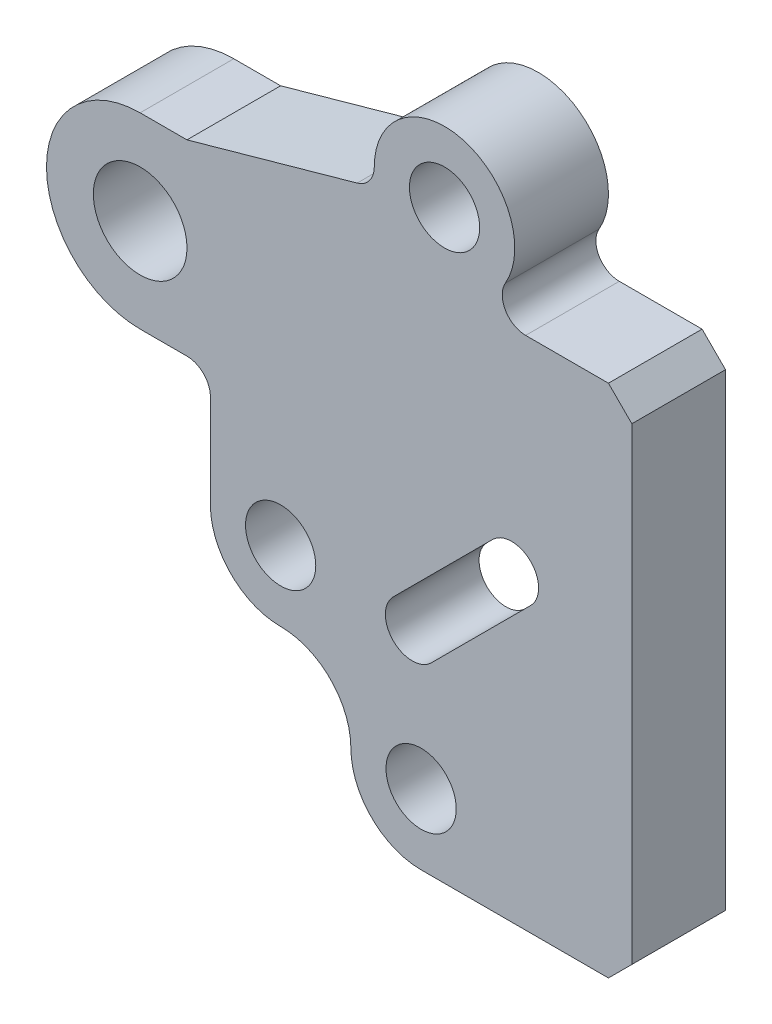
ISO-10303-21;
HEADER;
FILE_DESCRIPTION(('STEP AP214'),'2;1');
FILE_NAME('part.step','',(''),(''),'','','');
FILE_SCHEMA(('AUTOMOTIVE_DESIGN { 1 0 10303 214 1 1 1 1 }'));
ENDSEC;
DATA;
#1=APPLICATION_CONTEXT('core data for automotive mechanical design processes');
#2=APPLICATION_PROTOCOL_DEFINITION('international standard','automotive_design',2000,#1);
#3=PRODUCT_CONTEXT('',#1,'mechanical');
#4=PRODUCT('Part','Part','',(#3));
#5=PRODUCT_RELATED_PRODUCT_CATEGORY('part','',(#4));
#6=PRODUCT_DEFINITION_FORMATION('','',#4);
#7=PRODUCT_DEFINITION_CONTEXT('part definition',#1,'design');
#8=PRODUCT_DEFINITION('design','',#6,#7);
#9=PRODUCT_DEFINITION_SHAPE('','',#8);
#10=(LENGTH_UNIT() NAMED_UNIT(*) SI_UNIT(.MILLI.,.METRE.));
#11=(NAMED_UNIT(*) PLANE_ANGLE_UNIT() SI_UNIT($,.RADIAN.));
#12=(NAMED_UNIT(*) SI_UNIT($,.STERADIAN.) SOLID_ANGLE_UNIT());
#13=UNCERTAINTY_MEASURE_WITH_UNIT(LENGTH_MEASURE(1.E-05),#10,'distance_accuracy_value','');
#14=(GEOMETRIC_REPRESENTATION_CONTEXT(3) GLOBAL_UNCERTAINTY_ASSIGNED_CONTEXT((#13)) GLOBAL_UNIT_ASSIGNED_CONTEXT((#10,
#11,#12)) REPRESENTATION_CONTEXT('',''));
#15=CARTESIAN_POINT('',(0.,0.,0.));
#16=DIRECTION('',(0.,0.,1.));
#17=DIRECTION('',(1.,0.,0.));
#18=AXIS2_PLACEMENT_3D('',#15,#16,#17);
#19=CARTESIAN_POINT('',(45.,35.,10.));
#20=DIRECTION('',(0.,0.,-1.));
#21=DIRECTION('',(-1.,0.,0.));
#22=AXIS2_PLACEMENT_3D('',#19,#20,#21);
#23=CYLINDRICAL_SURFACE('',#22,4.99999999999991);
#24=CARTESIAN_POINT('',(45.,35.,-10.));
#25=DIRECTION('',(0.,0.,1.));
#26=DIRECTION('',(1.,0.,0.));
#27=AXIS2_PLACEMENT_3D('',#24,#25,#26);
#28=CIRCLE('',#27,4.99999999999991);
#29=CARTESIAN_POINT('',(46.3490951125699,30.1854447373366,-10.));
#30=VERTEX_POINT('',#29);
#31=CARTESIAN_POINT('',(49.9999999999998,35.,-10.));
#32=VERTEX_POINT('',#31);
#33=EDGE_CURVE('E261',#30,#32,#28,.T.);
#34=ORIENTED_EDGE('',*,*,#33,.F.);
#35=DIRECTION('',(0.,0.,-1.));
#36=VECTOR('',#35,1.);
#37=CARTESIAN_POINT('',(46.3490951125699,30.1854447373366,10.));
#38=LINE('',#37,#36);
#39=CARTESIAN_POINT('',(46.3490951125699,30.1854447373366,10.));
#40=VERTEX_POINT('',#39);
#41=EDGE_CURVE('E11',#40,#30,#38,.T.);
#42=ORIENTED_EDGE('',*,*,#41,.F.);
#43=CARTESIAN_POINT('',(45.,35.,10.));
#44=DIRECTION('',(0.,0.,1.));
#45=DIRECTION('',(1.,0.,0.));
#46=AXIS2_PLACEMENT_3D('',#43,#44,#45);
#47=CIRCLE('',#46,4.99999999999991);
#48=CARTESIAN_POINT('',(49.9999999999998,35.,10.));
#49=VERTEX_POINT('',#48);
#50=EDGE_CURVE('E419',#40,#49,#47,.T.);
#51=ORIENTED_EDGE('',*,*,#50,.T.);
#52=DIRECTION('',(0.,0.,-1.));
#53=VECTOR('',#52,1.);
#54=CARTESIAN_POINT('',(49.9999999999998,35.,10.));
#55=LINE('',#54,#53);
#56=EDGE_CURVE('E138',#49,#32,#55,.T.);
#57=ORIENTED_EDGE('',*,*,#56,.T.);
#58=EDGE_LOOP('',(#34,#42,#51,#57));
#59=FACE_BOUND('',#58,.T.);
#60=ADVANCED_FACE('F45',(#59),#23,.F.);
#61=CARTESIAN_POINT('',(-4.46821133014184,15.9458367121687,10.));
#62=DIRECTION('',(-0.269819022514005,0.962911052532677,0.));
#63=DIRECTION('',(-0.962911052532677,-0.269819022514005,0.));
#64=AXIS2_PLACEMENT_3D('',#61,#62,#63);
#65=PLANE('',#64);
#66=DIRECTION('',(0.962911052532676,0.269819022514005,0.));
#67=VECTOR('',#66,1.);
#68=CARTESIAN_POINT('',(-4.46821133014184,15.9458367121687,-10.));
#69=LINE('',#68,#67);
#70=CARTESIAN_POINT('',(10.,20.,-10.));
#71=VERTEX_POINT('',#70);
#72=EDGE_CURVE('E265',#71,#30,#69,.T.);
#73=ORIENTED_EDGE('',*,*,#72,.F.);
#74=DIRECTION('',(0.,0.,-1.));
#75=VECTOR('',#74,1.);
#76=CARTESIAN_POINT('',(10.,20.,10.));
#77=LINE('',#76,#75);
#78=CARTESIAN_POINT('',(10.,20.,10.));
#79=VERTEX_POINT('',#78);
#80=EDGE_CURVE('E56',#79,#71,#77,.T.);
#81=ORIENTED_EDGE('',*,*,#80,.F.);
#82=DIRECTION('',(0.962911052532676,0.269819022514005,0.));
#83=VECTOR('',#82,1.);
#84=CARTESIAN_POINT('',(-4.46821133014184,15.9458367121687,10.));
#85=LINE('',#84,#83);
#86=EDGE_CURVE('E429',#79,#40,#85,.T.);
#87=ORIENTED_EDGE('',*,*,#86,.T.);
#88=ORIENTED_EDGE('',*,*,#41,.T.);
#89=EDGE_LOOP('',(#73,#81,#87,#88));
#90=FACE_BOUND('',#89,.T.);
#91=ADVANCED_FACE('F486',(#90),#65,.T.);
#92=CARTESIAN_POINT('',(0.,20.,10.));
#93=DIRECTION('',(0.,1.,0.));
#94=DIRECTION('',(0.,0.,1.));
#95=AXIS2_PLACEMENT_3D('',#92,#93,#94);
#96=PLANE('',#95);
#97=DIRECTION('',(1.,0.,0.));
#98=VECTOR('',#97,1.);
#99=CARTESIAN_POINT('',(0.,20.,-10.));
#100=LINE('',#99,#98);
#101=CARTESIAN_POINT('',(0.,20.,-10.));
#102=VERTEX_POINT('',#101);
#103=EDGE_CURVE('E269',#102,#71,#100,.T.);
#104=ORIENTED_EDGE('',*,*,#103,.F.);
#105=DIRECTION('',(0.,0.,-1.));
#106=VECTOR('',#105,1.);
#107=CARTESIAN_POINT('',(0.,20.,10.));
#108=LINE('',#107,#106);
#109=CARTESIAN_POINT('',(0.,20.,10.));
#110=VERTEX_POINT('',#109);
#111=EDGE_CURVE('E384',#110,#102,#108,.T.);
#112=ORIENTED_EDGE('',*,*,#111,.F.);
#113=DIRECTION('',(1.,0.,0.));
#114=VECTOR('',#113,1.);
#115=CARTESIAN_POINT('',(0.,20.,10.));
#116=LINE('',#115,#114);
#117=EDGE_CURVE('E433',#110,#79,#116,.T.);
#118=ORIENTED_EDGE('',*,*,#117,.T.);
#119=ORIENTED_EDGE('',*,*,#80,.T.);
#120=EDGE_LOOP('',(#104,#112,#118,#119));
#121=FACE_BOUND('',#120,.T.);
#122=ADVANCED_FACE('F489',(#121),#96,.T.);
#123=CARTESIAN_POINT('',(0.,0.,10.));
#124=DIRECTION('',(0.,0.,-1.));
#125=DIRECTION('',(-1.,0.,0.));
#126=AXIS2_PLACEMENT_3D('',#123,#124,#125);
#127=CYLINDRICAL_SURFACE('',#126,20.);
#128=CARTESIAN_POINT('',(0.,0.,-10.));
#129=DIRECTION('',(0.,0.,1.));
#130=DIRECTION('',(1.,0.,0.));
#131=AXIS2_PLACEMENT_3D('',#128,#129,#130);
#132=CIRCLE('',#131,20.);
#133=CARTESIAN_POINT('',(0.,-20.,-10.));
#134=VERTEX_POINT('',#133);
#135=EDGE_CURVE('E273',#102,#134,#132,.T.);
#136=ORIENTED_EDGE('',*,*,#135,.T.);
#137=DIRECTION('',(0.,0.,-1.));
#138=VECTOR('',#137,1.);
#139=CARTESIAN_POINT('',(0.,-20.,10.));
#140=LINE('',#139,#138);
#141=CARTESIAN_POINT('',(0.,-20.,10.));
#142=VERTEX_POINT('',#141);
#143=EDGE_CURVE('E380',#142,#134,#140,.T.);
#144=ORIENTED_EDGE('',*,*,#143,.F.);
#145=CARTESIAN_POINT('',(0.,0.,10.));
#146=DIRECTION('',(0.,0.,1.));
#147=DIRECTION('',(1.,0.,0.));
#148=AXIS2_PLACEMENT_3D('',#145,#146,#147);
#149=CIRCLE('',#148,20.);
#150=EDGE_CURVE('E437',#110,#142,#149,.T.);
#151=ORIENTED_EDGE('',*,*,#150,.F.);
#152=ORIENTED_EDGE('',*,*,#111,.T.);
#153=EDGE_LOOP('',(#136,#144,#151,#152));
#154=FACE_BOUND('',#153,.T.);
#155=ADVANCED_FACE('F495',(#154),#127,.T.);
#156=CARTESIAN_POINT('',(0.,-20.,10.));
#157=DIRECTION('',(0.,1.,0.));
#158=DIRECTION('',(0.,0.,1.));
#159=AXIS2_PLACEMENT_3D('',#156,#157,#158);
#160=PLANE('',#159);
#161=DIRECTION('',(1.,0.,0.));
#162=VECTOR('',#161,1.);
#163=CARTESIAN_POINT('',(0.,-20.,-10.));
#164=LINE('',#163,#162);
#165=CARTESIAN_POINT('',(10.,-20.,-10.));
#166=VERTEX_POINT('',#165);
#167=EDGE_CURVE('E277',#134,#166,#164,.T.);
#168=ORIENTED_EDGE('',*,*,#167,.T.);
#169=DIRECTION('',(0.,0.,-1.));
#170=VECTOR('',#169,1.);
#171=CARTESIAN_POINT('',(10.,-20.,10.));
#172=LINE('',#171,#170);
#173=CARTESIAN_POINT('',(10.,-20.,10.));
#174=VERTEX_POINT('',#173);
#175=EDGE_CURVE('E377',#174,#166,#172,.T.);
#176=ORIENTED_EDGE('',*,*,#175,.F.);
#177=DIRECTION('',(1.,0.,0.));
#178=VECTOR('',#177,1.);
#179=CARTESIAN_POINT('',(0.,-20.,10.));
#180=LINE('',#179,#178);
#181=EDGE_CURVE('E441',#142,#174,#180,.T.);
#182=ORIENTED_EDGE('',*,*,#181,.F.);
#183=ORIENTED_EDGE('',*,*,#143,.T.);
#184=EDGE_LOOP('',(#168,#176,#182,#183));
#185=FACE_BOUND('',#184,.T.);
#186=ADVANCED_FACE('F498',(#185),#160,.F.);
#187=CARTESIAN_POINT('',(10.,-25.,10.));
#188=DIRECTION('',(0.,0.,-1.));
#189=DIRECTION('',(-1.,0.,0.));
#190=AXIS2_PLACEMENT_3D('',#187,#188,#189);
#191=CYLINDRICAL_SURFACE('',#190,5.);
#192=CARTESIAN_POINT('',(10.,-25.,-10.));
#193=DIRECTION('',(0.,0.,1.));
#194=DIRECTION('',(1.,0.,0.));
#195=AXIS2_PLACEMENT_3D('',#192,#193,#194);
#196=CIRCLE('',#195,5.);
#197=CARTESIAN_POINT('',(15.,-25.,-10.));
#198=VERTEX_POINT('',#197);
#199=EDGE_CURVE('E281',#198,#166,#196,.T.);
#200=ORIENTED_EDGE('',*,*,#199,.F.);
#201=DIRECTION('',(0.,0.,-1.));
#202=VECTOR('',#201,1.);
#203=CARTESIAN_POINT('',(15.,-25.,10.));
#204=LINE('',#203,#202);
#205=CARTESIAN_POINT('',(15.,-25.,10.));
#206=VERTEX_POINT('',#205);
#207=EDGE_CURVE('E374',#206,#198,#204,.T.);
#208=ORIENTED_EDGE('',*,*,#207,.F.);
#209=CARTESIAN_POINT('',(10.,-25.,10.));
#210=DIRECTION('',(0.,0.,1.));
#211=DIRECTION('',(1.,0.,0.));
#212=AXIS2_PLACEMENT_3D('',#209,#210,#211);
#213=CIRCLE('',#212,5.);
#214=EDGE_CURVE('E444',#206,#174,#213,.T.);
#215=ORIENTED_EDGE('',*,*,#214,.T.);
#216=ORIENTED_EDGE('',*,*,#175,.T.);
#217=EDGE_LOOP('',(#200,#208,#215,#216));
#218=FACE_BOUND('',#217,.T.);
#219=ADVANCED_FACE('F501',(#218),#191,.F.);
#220=CARTESIAN_POINT('',(15.,0.,10.));
#221=DIRECTION('',(1.,0.,0.));
#222=DIRECTION('',(0.,1.,0.));
#223=AXIS2_PLACEMENT_3D('',#220,#221,#222);
#224=PLANE('',#223);
#225=DIRECTION('',(0.,-1.,0.));
#226=VECTOR('',#225,1.);
#227=CARTESIAN_POINT('',(15.,0.,-10.));
#228=LINE('',#227,#226);
#229=CARTESIAN_POINT('',(15.,-45.,-10.));
#230=VERTEX_POINT('',#229);
#231=EDGE_CURVE('E285',#198,#230,#228,.T.);
#232=ORIENTED_EDGE('',*,*,#231,.T.);
#233=DIRECTION('',(0.,0.,-1.));
#234=VECTOR('',#233,1.);
#235=CARTESIAN_POINT('',(15.,-45.,10.));
#236=LINE('',#235,#234);
#237=CARTESIAN_POINT('',(15.,-45.,10.));
#238=VERTEX_POINT('',#237);
#239=EDGE_CURVE('E370',#238,#230,#236,.T.);
#240=ORIENTED_EDGE('',*,*,#239,.F.);
#241=DIRECTION('',(0.,-1.,0.));
#242=VECTOR('',#241,1.);
#243=CARTESIAN_POINT('',(15.,0.,10.));
#244=LINE('',#243,#242);
#245=EDGE_CURVE('E448',#206,#238,#244,.T.);
#246=ORIENTED_EDGE('',*,*,#245,.F.);
#247=ORIENTED_EDGE('',*,*,#207,.T.);
#248=EDGE_LOOP('',(#232,#240,#246,#247));
#249=FACE_BOUND('',#248,.T.);
#250=ADVANCED_FACE('F507',(#249),#224,.F.);
#251=CARTESIAN_POINT('',(30.,-45.,10.));
#252=DIRECTION('',(0.,0.,-1.));
#253=DIRECTION('',(-1.,0.,0.));
#254=AXIS2_PLACEMENT_3D('',#251,#252,#253);
#255=CYLINDRICAL_SURFACE('',#254,15.);
#256=CARTESIAN_POINT('',(30.,-45.,-10.));
#257=DIRECTION('',(0.,0.,1.));
#258=DIRECTION('',(1.,0.,0.));
#259=AXIS2_PLACEMENT_3D('',#256,#257,#258);
#260=CIRCLE('',#259,15.);
#261=CARTESIAN_POINT('',(30.0000000000001,-60.,-10.));
#262=VERTEX_POINT('',#261);
#263=EDGE_CURVE('E289',#230,#262,#260,.T.);
#264=ORIENTED_EDGE('',*,*,#263,.T.);
#265=DIRECTION('',(0.,0.,-1.));
#266=VECTOR('',#265,1.);
#267=CARTESIAN_POINT('',(30.0000000000001,-60.,10.));
#268=LINE('',#267,#266);
#269=CARTESIAN_POINT('',(30.0000000000001,-60.,10.));
#270=VERTEX_POINT('',#269);
#271=EDGE_CURVE('E367',#270,#262,#268,.T.);
#272=ORIENTED_EDGE('',*,*,#271,.F.);
#273=CARTESIAN_POINT('',(30.,-45.,10.));
#274=DIRECTION('',(0.,0.,1.));
#275=DIRECTION('',(1.,0.,0.));
#276=AXIS2_PLACEMENT_3D('',#273,#274,#275);
#277=CIRCLE('',#276,15.);
#278=EDGE_CURVE('E452',#238,#270,#277,.T.);
#279=ORIENTED_EDGE('',*,*,#278,.F.);
#280=ORIENTED_EDGE('',*,*,#239,.T.);
#281=EDGE_LOOP('',(#264,#272,#279,#280));
#282=FACE_BOUND('',#281,.T.);
#283=ADVANCED_FACE('F510',(#282),#255,.T.);
#284=CARTESIAN_POINT('',(30.0000000000003,-75.,10.));
#285=DIRECTION('',(0.,0.,-1.));
#286=DIRECTION('',(-1.,0.,0.));
#287=AXIS2_PLACEMENT_3D('',#284,#285,#286);
#288=CYLINDRICAL_SURFACE('',#287,15.);
#289=CARTESIAN_POINT('',(30.0000000000003,-75.,-10.));
#290=DIRECTION('',(0.,0.,1.));
#291=DIRECTION('',(1.,0.,0.));
#292=AXIS2_PLACEMENT_3D('',#289,#290,#291);
#293=CIRCLE('',#292,15.);
#294=CARTESIAN_POINT('',(45.0000000000003,-75.,-10.));
#295=VERTEX_POINT('',#294);
#296=EDGE_CURVE('E293',#295,#262,#293,.T.);
#297=ORIENTED_EDGE('',*,*,#296,.F.);
#298=DIRECTION('',(0.,0.,-1.));
#299=VECTOR('',#298,1.);
#300=CARTESIAN_POINT('',(45.0000000000003,-75.,10.));
#301=LINE('',#300,#299);
#302=CARTESIAN_POINT('',(45.0000000000003,-75.,10.));
#303=VERTEX_POINT('',#302);
#304=EDGE_CURVE('E364',#303,#295,#301,.T.);
#305=ORIENTED_EDGE('',*,*,#304,.F.);
#306=CARTESIAN_POINT('',(30.0000000000003,-75.,10.));
#307=DIRECTION('',(0.,0.,1.));
#308=DIRECTION('',(1.,0.,0.));
#309=AXIS2_PLACEMENT_3D('',#306,#307,#308);
#310=CIRCLE('',#309,15.);
#311=EDGE_CURVE('E455',#303,#270,#310,.T.);
#312=ORIENTED_EDGE('',*,*,#311,.T.);
#313=ORIENTED_EDGE('',*,*,#271,.T.);
#314=EDGE_LOOP('',(#297,#305,#312,#313));
#315=FACE_BOUND('',#314,.T.);
#316=ADVANCED_FACE('F513',(#315),#288,.F.);
#317=CARTESIAN_POINT('',(60.0000000000003,-75.,10.));
#318=DIRECTION('',(0.,0.,-1.));
#319=DIRECTION('',(-1.,0.,0.));
#320=AXIS2_PLACEMENT_3D('',#317,#318,#319);
#321=CYLINDRICAL_SURFACE('',#320,15.);
#322=CARTESIAN_POINT('',(60.0000000000003,-75.,-10.));
#323=DIRECTION('',(0.,0.,1.));
#324=DIRECTION('',(1.,0.,0.));
#325=AXIS2_PLACEMENT_3D('',#322,#323,#324);
#326=CIRCLE('',#325,15.);
#327=CARTESIAN_POINT('',(60.0000000000003,-90.,-10.));
#328=VERTEX_POINT('',#327);
#329=EDGE_CURVE('E297',#295,#328,#326,.T.);
#330=ORIENTED_EDGE('',*,*,#329,.T.);
#331=DIRECTION('',(0.,0.,-1.));
#332=VECTOR('',#331,1.);
#333=CARTESIAN_POINT('',(60.0000000000003,-90.,10.));
#334=LINE('',#333,#332);
#335=CARTESIAN_POINT('',(60.0000000000003,-90.,10.));
#336=VERTEX_POINT('',#335);
#337=EDGE_CURVE('E360',#336,#328,#334,.T.);
#338=ORIENTED_EDGE('',*,*,#337,.F.);
#339=CARTESIAN_POINT('',(60.0000000000003,-75.,10.));
#340=DIRECTION('',(0.,0.,1.));
#341=DIRECTION('',(1.,0.,0.));
#342=AXIS2_PLACEMENT_3D('',#339,#340,#341);
#343=CIRCLE('',#342,15.);
#344=EDGE_CURVE('E459',#303,#336,#343,.T.);
#345=ORIENTED_EDGE('',*,*,#344,.F.);
#346=ORIENTED_EDGE('',*,*,#304,.T.);
#347=EDGE_LOOP('',(#330,#338,#345,#346));
#348=FACE_BOUND('',#347,.T.);
#349=ADVANCED_FACE('F518',(#348),#321,.T.);
#350=CARTESIAN_POINT('',(0.,-90.,10.));
#351=DIRECTION('',(0.,1.,0.));
#352=DIRECTION('',(0.,0.,1.));
#353=AXIS2_PLACEMENT_3D('',#350,#351,#352);
#354=PLANE('',#353);
#355=DIRECTION('',(1.,0.,0.));
#356=VECTOR('',#355,1.);
#357=CARTESIAN_POINT('',(0.,-90.,-10.));
#358=LINE('',#357,#356);
#359=CARTESIAN_POINT('',(100.,-90.,-10.));
#360=VERTEX_POINT('',#359);
#361=EDGE_CURVE('E301',#328,#360,#358,.T.);
#362=ORIENTED_EDGE('',*,*,#361,.T.);
#363=DIRECTION('',(0.,0.,-1.));
#364=VECTOR('',#363,1.);
#365=CARTESIAN_POINT('',(100.,-90.,10.));
#366=LINE('',#365,#364);
#367=CARTESIAN_POINT('',(100.,-90.,10.));
#368=VERTEX_POINT('',#367);
#369=EDGE_CURVE('E356',#368,#360,#366,.T.);
#370=ORIENTED_EDGE('',*,*,#369,.F.);
#371=DIRECTION('',(1.,0.,0.));
#372=VECTOR('',#371,1.);
#373=CARTESIAN_POINT('',(0.,-90.,10.));
#374=LINE('',#373,#372);
#375=EDGE_CURVE('E463',#336,#368,#374,.T.);
#376=ORIENTED_EDGE('',*,*,#375,.F.);
#377=ORIENTED_EDGE('',*,*,#337,.T.);
#378=EDGE_LOOP('',(#362,#370,#376,#377));
#379=FACE_BOUND('',#378,.T.);
#380=ADVANCED_FACE('F521',(#379),#354,.F.);
#381=CARTESIAN_POINT('',(95.0000000000004,-94.9999999999999,10.));
#382=DIRECTION('',(-0.707106781186549,0.707106781186546,0.));
#383=DIRECTION('',(-0.707106781186546,-0.707106781186549,0.));
#384=AXIS2_PLACEMENT_3D('',#381,#382,#383);
#385=PLANE('',#384);
#386=DIRECTION('',(0.707106781186546,0.707106781186549,0.));
#387=VECTOR('',#386,1.);
#388=CARTESIAN_POINT('',(95.0000000000004,-94.9999999999999,-10.));
#389=LINE('',#388,#387);
#390=CARTESIAN_POINT('',(105.,-85.,-10.));
#391=VERTEX_POINT('',#390);
#392=EDGE_CURVE('E305',#360,#391,#389,.T.);
#393=ORIENTED_EDGE('',*,*,#392,.T.);
#394=DIRECTION('',(0.,0.,-1.));
#395=VECTOR('',#394,1.);
#396=CARTESIAN_POINT('',(105.,-85.,10.));
#397=LINE('',#396,#395);
#398=CARTESIAN_POINT('',(105.,-85.,10.));
#399=VERTEX_POINT('',#398);
#400=EDGE_CURVE('E352',#399,#391,#397,.T.);
#401=ORIENTED_EDGE('',*,*,#400,.F.);
#402=DIRECTION('',(0.707106781186546,0.707106781186549,0.));
#403=VECTOR('',#402,1.);
#404=CARTESIAN_POINT('',(95.0000000000004,-94.9999999999999,10.));
#405=LINE('',#404,#403);
#406=EDGE_CURVE('E467',#368,#399,#405,.T.);
#407=ORIENTED_EDGE('',*,*,#406,.F.);
#408=ORIENTED_EDGE('',*,*,#369,.T.);
#409=EDGE_LOOP('',(#393,#401,#407,#408));
#410=FACE_BOUND('',#409,.T.);
#411=ADVANCED_FACE('F523',(#410),#385,.F.);
#412=CARTESIAN_POINT('',(105.,4.08006961549745E-13,10.));
#413=DIRECTION('',(-1.,0.,0.));
#414=DIRECTION('',(0.,-1.,0.));
#415=AXIS2_PLACEMENT_3D('',#412,#413,#414);
#416=PLANE('',#415);
#417=DIRECTION('',(0.,1.,0.));
#418=VECTOR('',#417,1.);
#419=CARTESIAN_POINT('',(105.,4.08006961549745E-13,-10.));
#420=LINE('',#419,#418);
#421=CARTESIAN_POINT('',(105.,15.,-10.));
#422=VERTEX_POINT('',#421);
#423=EDGE_CURVE('E309',#391,#422,#420,.T.);
#424=ORIENTED_EDGE('',*,*,#423,.T.);
#425=DIRECTION('',(0.,0.,-1.));
#426=VECTOR('',#425,1.);
#427=CARTESIAN_POINT('',(105.,15.,10.));
#428=LINE('',#427,#426);
#429=CARTESIAN_POINT('',(105.,15.,10.));
#430=VERTEX_POINT('',#429);
#431=EDGE_CURVE('E348',#430,#422,#428,.T.);
#432=ORIENTED_EDGE('',*,*,#431,.F.);
#433=DIRECTION('',(0.,1.,0.));
#434=VECTOR('',#433,1.);
#435=CARTESIAN_POINT('',(105.,4.08006961549745E-13,10.));
#436=LINE('',#435,#434);
#437=EDGE_CURVE('E471',#399,#430,#436,.T.);
#438=ORIENTED_EDGE('',*,*,#437,.F.);
#439=ORIENTED_EDGE('',*,*,#400,.T.);
#440=EDGE_LOOP('',(#424,#432,#438,#439));
#441=FACE_BOUND('',#440,.T.);
#442=ADVANCED_FACE('F477',(#441),#416,.F.);
#443=CARTESIAN_POINT('',(59.9999999999998,60.,10.));
#444=DIRECTION('',(-0.707106781186546,-0.707106781186549,0.));
#445=DIRECTION('',(0.707106781186549,-0.707106781186546,0.));
#446=AXIS2_PLACEMENT_3D('',#443,#444,#445);
#447=PLANE('',#446);
#448=DIRECTION('',(-0.707106781186549,0.707106781186546,0.));
#449=VECTOR('',#448,1.);
#450=CARTESIAN_POINT('',(59.9999999999998,60.,-10.));
#451=LINE('',#450,#449);
#452=CARTESIAN_POINT('',(99.9999999999999,20.,-10.));
#453=VERTEX_POINT('',#452);
#454=EDGE_CURVE('E313',#422,#453,#451,.T.);
#455=ORIENTED_EDGE('',*,*,#454,.T.);
#456=DIRECTION('',(0.,0.,-1.));
#457=VECTOR('',#456,1.);
#458=CARTESIAN_POINT('',(99.9999999999999,20.,10.));
#459=LINE('',#458,#457);
#460=CARTESIAN_POINT('',(99.9999999999999,20.,10.));
#461=VERTEX_POINT('',#460);
#462=EDGE_CURVE('E219',#461,#453,#459,.T.);
#463=ORIENTED_EDGE('',*,*,#462,.F.);
#464=DIRECTION('',(-0.707106781186549,0.707106781186546,0.));
#465=VECTOR('',#464,1.);
#466=CARTESIAN_POINT('',(59.9999999999998,60.,10.));
#467=LINE('',#466,#465);
#468=EDGE_CURVE('E205',#430,#461,#467,.T.);
#469=ORIENTED_EDGE('',*,*,#468,.F.);
#470=ORIENTED_EDGE('',*,*,#431,.T.);
#471=EDGE_LOOP('',(#455,#463,#469,#470));
#472=FACE_BOUND('',#471,.T.);
#473=ADVANCED_FACE('F479',(#472),#447,.F.);
#474=CARTESIAN_POINT('',(0.,20.,10.));
#475=DIRECTION('',(0.,-1.,0.));
#476=DIRECTION('',(0.,0.,-1.));
#477=AXIS2_PLACEMENT_3D('',#474,#475,#476);
#478=PLANE('',#477);
#479=DIRECTION('',(-1.,0.,0.));
#480=VECTOR('',#479,1.);
#481=CARTESIAN_POINT('',(0.,20.,-10.));
#482=LINE('',#481,#480);
#483=CARTESIAN_POINT('',(82.320508075689,20.,-10.));
#484=VERTEX_POINT('',#483);
#485=EDGE_CURVE('E214',#453,#484,#482,.T.);
#486=ORIENTED_EDGE('',*,*,#485,.T.);
#487=DIRECTION('',(0.,0.,-1.));
#488=VECTOR('',#487,1.);
#489=CARTESIAN_POINT('',(82.320508075689,20.,10.));
#490=LINE('',#489,#488);
#491=CARTESIAN_POINT('',(82.320508075689,20.,10.));
#492=VERTEX_POINT('',#491);
#493=EDGE_CURVE('E212',#492,#484,#490,.T.);
#494=ORIENTED_EDGE('',*,*,#493,.F.);
#495=DIRECTION('',(-1.,0.,0.));
#496=VECTOR('',#495,1.);
#497=CARTESIAN_POINT('',(0.,20.,10.));
#498=LINE('',#497,#496);
#499=EDGE_CURVE('E198',#461,#492,#498,.T.);
#500=ORIENTED_EDGE('',*,*,#499,.F.);
#501=ORIENTED_EDGE('',*,*,#462,.T.);
#502=EDGE_LOOP('',(#486,#494,#500,#501));
#503=FACE_BOUND('',#502,.T.);
#504=ADVANCED_FACE('F213',(#503),#478,.F.);
#505=CARTESIAN_POINT('',(82.320508075689,25.,10.));
#506=DIRECTION('',(0.,0.,-1.));
#507=DIRECTION('',(-1.,0.,0.));
#508=AXIS2_PLACEMENT_3D('',#505,#506,#507);
#509=CYLINDRICAL_SURFACE('',#508,5.);
#510=CARTESIAN_POINT('',(82.320508075689,25.,-10.));
#511=DIRECTION('',(0.,0.,1.));
#512=DIRECTION('',(1.,0.,0.));
#513=AXIS2_PLACEMENT_3D('',#510,#511,#512);
#514=CIRCLE('',#513,5.);
#515=CARTESIAN_POINT('',(77.9903810567668,27.5,-10.));
#516=VERTEX_POINT('',#515);
#517=EDGE_CURVE('E319',#516,#484,#514,.T.);
#518=ORIENTED_EDGE('',*,*,#517,.F.);
#519=DIRECTION('',(0.,0.,-1.));
#520=VECTOR('',#519,1.);
#521=CARTESIAN_POINT('',(77.9903810567668,27.5,10.));
#522=LINE('',#521,#520);
#523=CARTESIAN_POINT('',(77.9903810567668,27.5,10.));
#524=VERTEX_POINT('',#523);
#525=EDGE_CURVE('E131',#524,#516,#522,.T.);
#526=ORIENTED_EDGE('',*,*,#525,.F.);
#527=CARTESIAN_POINT('',(82.320508075689,25.,10.));
#528=DIRECTION('',(0.,0.,1.));
#529=DIRECTION('',(1.,0.,0.));
#530=AXIS2_PLACEMENT_3D('',#527,#528,#529);
#531=CIRCLE('',#530,5.);
#532=EDGE_CURVE('E203',#524,#492,#531,.T.);
#533=ORIENTED_EDGE('',*,*,#532,.T.);
#534=ORIENTED_EDGE('',*,*,#493,.T.);
#535=EDGE_LOOP('',(#518,#526,#533,#534));
#536=FACE_BOUND('',#535,.T.);
#537=ADVANCED_FACE('F221',(#536),#509,.F.);
#538=CARTESIAN_POINT('',(79.3329418033667,-25.3389440245692,10.));
#539=DIRECTION('',(0.,0.,-1.));
#540=DIRECTION('',(-1.,0.,0.));
#541=AXIS2_PLACEMENT_3D('',#538,#539,#540);
#542=CYLINDRICAL_SURFACE('',#541,5.75032968390541);
#543=CARTESIAN_POINT('',(79.3329418033667,-25.3389440245692,-10.));
#544=DIRECTION('',(0.,0.,1.));
#545=DIRECTION('',(1.,0.,0.));
#546=AXIS2_PLACEMENT_3D('',#543,#544,#545);
#547=CIRCLE('',#546,5.75032968390541);
#548=CARTESIAN_POINT('',(83.3990389169146,-29.405041138117,-10.));
#549=VERTEX_POINT('',#548);
#550=CARTESIAN_POINT('',(75.2668446898189,-21.2728469110214,-10.));
#551=VERTEX_POINT('',#550);
#552=EDGE_CURVE('E245',#549,#551,#547,.T.);
#553=ORIENTED_EDGE('',*,*,#552,.F.);
#554=DIRECTION('',(0.,0.,-1.));
#555=VECTOR('',#554,1.);
#556=CARTESIAN_POINT('',(83.3990389169146,-29.405041138117,10.));
#557=LINE('',#556,#555);
#558=CARTESIAN_POINT('',(83.3990389169146,-29.405041138117,10.));
#559=VERTEX_POINT('',#558);
#560=EDGE_CURVE('E49',#559,#549,#557,.T.);
#561=ORIENTED_EDGE('',*,*,#560,.F.);
#562=CARTESIAN_POINT('',(79.3329418033667,-25.3389440245692,10.));
#563=DIRECTION('',(0.,0.,1.));
#564=DIRECTION('',(1.,0.,0.));
#565=AXIS2_PLACEMENT_3D('',#562,#563,#564);
#566=CIRCLE('',#565,5.75032968390541);
#567=CARTESIAN_POINT('',(75.2668446898189,-21.2728469110214,10.));
#568=VERTEX_POINT('',#567);
#569=EDGE_CURVE('E341',#559,#568,#566,.T.);
#570=ORIENTED_EDGE('',*,*,#569,.T.);
#571=DIRECTION('',(0.,0.,-1.));
#572=VECTOR('',#571,1.);
#573=CARTESIAN_POINT('',(75.2668446898189,-21.2728469110214,10.));
#574=LINE('',#573,#572);
#575=EDGE_CURVE('E244',#568,#551,#574,.T.);
#576=ORIENTED_EDGE('',*,*,#575,.T.);
#577=EDGE_LOOP('',(#553,#561,#570,#576));
#578=FACE_BOUND('',#577,.T.);
#579=ADVANCED_FACE('F47',(#578),#542,.F.);
#580=CARTESIAN_POINT('',(56.4020400275159,-56.4020400275158,10.));
#581=DIRECTION('',(-0.707106781186548,0.707106781186547,0.));
#582=DIRECTION('',(-0.707106781186547,-0.707106781186548,0.));
#583=AXIS2_PLACEMENT_3D('',#580,#581,#582);
#584=PLANE('',#583);
#585=DIRECTION('',(0.707106781186547,0.707106781186548,0.));
#586=VECTOR('',#585,1.);
#587=CARTESIAN_POINT('',(56.4020400275159,-56.4020400275158,-10.));
#588=LINE('',#587,#586);
#589=CARTESIAN_POINT('',(62.1858354813182,-50.6182445737135,-10.));
#590=VERTEX_POINT('',#589);
#591=EDGE_CURVE('E249',#590,#549,#588,.T.);
#592=ORIENTED_EDGE('',*,*,#591,.F.);
#593=DIRECTION('',(0.,0.,-1.));
#594=VECTOR('',#593,1.);
#595=CARTESIAN_POINT('',(62.1858354813182,-50.6182445737135,10.));
#596=LINE('',#595,#594);
#597=CARTESIAN_POINT('',(62.1858354813182,-50.6182445737135,10.));
#598=VERTEX_POINT('',#597);
#599=EDGE_CURVE('E393',#598,#590,#596,.T.);
#600=ORIENTED_EDGE('',*,*,#599,.F.);
#601=DIRECTION('',(0.707106781186547,0.707106781186548,0.));
#602=VECTOR('',#601,1.);
#603=CARTESIAN_POINT('',(56.4020400275159,-56.4020400275158,10.));
#604=LINE('',#603,#602);
#605=EDGE_CURVE('E404',#598,#559,#604,.T.);
#606=ORIENTED_EDGE('',*,*,#605,.T.);
#607=ORIENTED_EDGE('',*,*,#560,.T.);
#608=EDGE_LOOP('',(#592,#600,#606,#607));
#609=FACE_BOUND('',#608,.T.);
#610=ADVANCED_FACE('F402',(#609),#584,.T.);
#611=CARTESIAN_POINT('',(58.1197383677704,-46.5521474601657,10.));
#612=DIRECTION('',(0.,0.,-1.));
#613=DIRECTION('',(-1.,0.,0.));
#614=AXIS2_PLACEMENT_3D('',#611,#612,#613);
#615=CYLINDRICAL_SURFACE('',#614,5.7503296839054);
#616=CARTESIAN_POINT('',(58.1197383677704,-46.5521474601657,-10.));
#617=DIRECTION('',(0.,0.,1.));
#618=DIRECTION('',(1.,0.,0.));
#619=AXIS2_PLACEMENT_3D('',#616,#617,#618);
#620=CIRCLE('',#619,5.7503296839054);
#621=CARTESIAN_POINT('',(54.0536412542225,-42.4860503466179,-10.));
#622=VERTEX_POINT('',#621);
#623=EDGE_CURVE('E253',#622,#590,#620,.T.);
#624=ORIENTED_EDGE('',*,*,#623,.F.);
#625=DIRECTION('',(0.,0.,-1.));
#626=VECTOR('',#625,1.);
#627=CARTESIAN_POINT('',(54.0536412542225,-42.4860503466179,10.));
#628=LINE('',#627,#626);
#629=CARTESIAN_POINT('',(54.0536412542225,-42.4860503466179,10.));
#630=VERTEX_POINT('',#629);
#631=EDGE_CURVE('E391',#630,#622,#628,.T.);
#632=ORIENTED_EDGE('',*,*,#631,.F.);
#633=CARTESIAN_POINT('',(58.1197383677704,-46.5521474601657,10.));
#634=DIRECTION('',(0.,0.,1.));
#635=DIRECTION('',(1.,0.,0.));
#636=AXIS2_PLACEMENT_3D('',#633,#634,#635);
#637=CIRCLE('',#636,5.7503296839054);
#638=EDGE_CURVE('E413',#630,#598,#637,.T.);
#639=ORIENTED_EDGE('',*,*,#638,.T.);
#640=ORIENTED_EDGE('',*,*,#599,.T.);
#641=EDGE_LOOP('',(#624,#632,#639,#640));
#642=FACE_BOUND('',#641,.T.);
#643=ADVANCED_FACE('F410',(#642),#615,.F.);
#644=CARTESIAN_POINT('',(65.,35.,10.));
#645=DIRECTION('',(0.,0.,-1.));
#646=DIRECTION('',(-1.,0.,0.));
#647=AXIS2_PLACEMENT_3D('',#644,#645,#646);
#648=CYLINDRICAL_SURFACE('',#647,7.5);
#649=CARTESIAN_POINT('',(65.,35.,10.));
#650=DIRECTION('',(0.,0.,1.));
#651=DIRECTION('',(1.,0.,0.));
#652=AXIS2_PLACEMENT_3D('',#649,#650,#651);
#653=CIRCLE('',#652,7.5);
#654=CARTESIAN_POINT('',(72.5,35.,10.));
#655=VERTEX_POINT('',#654);
#656=EDGE_CURVE('E236',#655,#655,#653,.T.);
#657=ORIENTED_EDGE('',*,*,#656,.T.);
#658=EDGE_LOOP('',(#657));
#659=FACE_BOUND('',#658,.T.);
#660=CARTESIAN_POINT('',(65.,35.,-10.));
#661=DIRECTION('',(0.,0.,1.));
#662=DIRECTION('',(1.,0.,0.));
#663=AXIS2_PLACEMENT_3D('',#660,#661,#662);
#664=CIRCLE('',#663,7.5);
#665=CARTESIAN_POINT('',(72.5,35.,-10.));
#666=VERTEX_POINT('',#665);
#667=EDGE_CURVE('E333',#666,#666,#664,.T.);
#668=ORIENTED_EDGE('',*,*,#667,.F.);
#669=EDGE_LOOP('',(#668));
#670=FACE_BOUND('',#669,.T.);
#671=ADVANCED_FACE('F544',(#659,#670),#648,.F.);
#672=CARTESIAN_POINT('',(30.,-45.,10.));
#673=DIRECTION('',(0.,0.,-1.));
#674=DIRECTION('',(-1.,0.,0.));
#675=AXIS2_PLACEMENT_3D('',#672,#673,#674);
#676=CYLINDRICAL_SURFACE('',#675,7.5);
#677=CARTESIAN_POINT('',(30.,-45.,10.));
#678=DIRECTION('',(0.,0.,1.));
#679=DIRECTION('',(1.,0.,0.));
#680=AXIS2_PLACEMENT_3D('',#677,#678,#679);
#681=CIRCLE('',#680,7.5);
#682=CARTESIAN_POINT('',(37.5,-45.,10.));
#683=VERTEX_POINT('',#682);
#684=EDGE_CURVE('E232',#683,#683,#681,.T.);
#685=ORIENTED_EDGE('',*,*,#684,.T.);
#686=EDGE_LOOP('',(#685));
#687=FACE_BOUND('',#686,.T.);
#688=CARTESIAN_POINT('',(30.,-45.,-10.));
#689=DIRECTION('',(0.,0.,1.));
#690=DIRECTION('',(1.,0.,0.));
#691=AXIS2_PLACEMENT_3D('',#688,#689,#690);
#692=CIRCLE('',#691,7.5);
#693=CARTESIAN_POINT('',(37.5,-45.,-10.));
#694=VERTEX_POINT('',#693);
#695=EDGE_CURVE('E329',#694,#694,#692,.T.);
#696=ORIENTED_EDGE('',*,*,#695,.F.);
#697=EDGE_LOOP('',(#696));
#698=FACE_BOUND('',#697,.T.);
#699=ADVANCED_FACE('F601',(#687,#698),#676,.F.);
#700=CARTESIAN_POINT('',(60.0000000000003,-75.,10.));
#701=DIRECTION('',(0.,0.,-1.));
#702=DIRECTION('',(-1.,0.,0.));
#703=AXIS2_PLACEMENT_3D('',#700,#701,#702);
#704=CYLINDRICAL_SURFACE('',#703,7.50000000000003);
#705=CARTESIAN_POINT('',(60.0000000000003,-75.,10.));
#706=DIRECTION('',(0.,0.,1.));
#707=DIRECTION('',(1.,0.,0.));
#708=AXIS2_PLACEMENT_3D('',#705,#706,#707);
#709=CIRCLE('',#708,7.50000000000003);
#710=CARTESIAN_POINT('',(67.5000000000003,-75.,10.));
#711=VERTEX_POINT('',#710);
#712=EDGE_CURVE('E225',#711,#711,#709,.T.);
#713=ORIENTED_EDGE('',*,*,#712,.T.);
#714=EDGE_LOOP('',(#713));
#715=FACE_BOUND('',#714,.T.);
#716=CARTESIAN_POINT('',(60.0000000000003,-75.,-10.));
#717=DIRECTION('',(0.,0.,1.));
#718=DIRECTION('',(1.,0.,0.));
#719=AXIS2_PLACEMENT_3D('',#716,#717,#718);
#720=CIRCLE('',#719,7.50000000000003);
#721=CARTESIAN_POINT('',(67.5000000000003,-75.,-10.));
#722=VERTEX_POINT('',#721);
#723=EDGE_CURVE('E325',#722,#722,#720,.T.);
#724=ORIENTED_EDGE('',*,*,#723,.F.);
#725=EDGE_LOOP('',(#724));
#726=FACE_BOUND('',#725,.T.);
#727=ADVANCED_FACE('F612',(#715,#726),#704,.F.);
#728=CARTESIAN_POINT('',(65.,35.,10.));
#729=DIRECTION('',(0.,0.,-1.));
#730=DIRECTION('',(-1.,0.,0.));
#731=AXIS2_PLACEMENT_3D('',#728,#729,#730);
#732=CYLINDRICAL_SURFACE('',#731,15.0000000000002);
#733=CARTESIAN_POINT('',(65.,35.,-10.));
#734=DIRECTION('',(0.,0.,1.));
#735=DIRECTION('',(1.,0.,0.));
#736=AXIS2_PLACEMENT_3D('',#733,#734,#735);
#737=CIRCLE('',#736,15.0000000000002);
#738=EDGE_CURVE('E322',#516,#32,#737,.T.);
#739=ORIENTED_EDGE('',*,*,#738,.T.);
#740=ORIENTED_EDGE('',*,*,#56,.F.);
#741=CARTESIAN_POINT('',(65.,35.,10.));
#742=DIRECTION('',(0.,0.,1.));
#743=DIRECTION('',(1.,0.,0.));
#744=AXIS2_PLACEMENT_3D('',#741,#742,#743);
#745=CIRCLE('',#744,15.0000000000002);
#746=EDGE_CURVE('E65',#524,#49,#745,.T.);
#747=ORIENTED_EDGE('',*,*,#746,.F.);
#748=ORIENTED_EDGE('',*,*,#525,.T.);
#749=EDGE_LOOP('',(#739,#740,#747,#748));
#750=FACE_BOUND('',#749,.T.);
#751=ADVANCED_FACE('F481',(#750),#732,.T.);
#752=CARTESIAN_POINT('',(48.2698458004203,-48.2698458004201,10.));
#753=DIRECTION('',(-0.707106781186549,0.707106781186546,0.));
#754=DIRECTION('',(-0.707106781186546,-0.707106781186549,0.));
#755=AXIS2_PLACEMENT_3D('',#752,#753,#754);
#756=PLANE('',#755);
#757=DIRECTION('',(0.707106781186546,0.707106781186549,0.));
#758=VECTOR('',#757,1.);
#759=CARTESIAN_POINT('',(48.2698458004203,-48.2698458004201,-10.));
#760=LINE('',#759,#758);
#761=EDGE_CURVE('E257',#622,#551,#760,.T.);
#762=ORIENTED_EDGE('',*,*,#761,.T.);
#763=ORIENTED_EDGE('',*,*,#575,.F.);
#764=DIRECTION('',(0.707106781186546,0.707106781186549,0.));
#765=VECTOR('',#764,1.);
#766=CARTESIAN_POINT('',(48.2698458004203,-48.2698458004201,10.));
#767=LINE('',#766,#765);
#768=EDGE_CURVE('E415',#630,#568,#767,.T.);
#769=ORIENTED_EDGE('',*,*,#768,.F.);
#770=ORIENTED_EDGE('',*,*,#631,.T.);
#771=EDGE_LOOP('',(#762,#763,#769,#770));
#772=FACE_BOUND('',#771,.T.);
#773=ADVANCED_FACE('F416',(#772),#756,.F.);
#774=CARTESIAN_POINT('',(0.,0.,10.));
#775=DIRECTION('',(0.,0.,-1.));
#776=DIRECTION('',(-1.,0.,0.));
#777=AXIS2_PLACEMENT_3D('',#774,#775,#776);
#778=CYLINDRICAL_SURFACE('',#777,10.);
#779=CARTESIAN_POINT('',(0.,0.,10.));
#780=DIRECTION('',(0.,0.,1.));
#781=DIRECTION('',(1.,0.,0.));
#782=AXIS2_PLACEMENT_3D('',#779,#780,#781);
#783=CIRCLE('',#782,10.);
#784=CARTESIAN_POINT('',(10.,0.,10.));
#785=VERTEX_POINT('',#784);
#786=EDGE_CURVE('E240',#785,#785,#783,.T.);
#787=ORIENTED_EDGE('',*,*,#786,.T.);
#788=EDGE_LOOP('',(#787));
#789=FACE_BOUND('',#788,.T.);
#790=CARTESIAN_POINT('',(0.,0.,-10.));
#791=DIRECTION('',(0.,0.,1.));
#792=DIRECTION('',(1.,0.,0.));
#793=AXIS2_PLACEMENT_3D('',#790,#791,#792);
#794=CIRCLE('',#793,10.);
#795=CARTESIAN_POINT('',(10.,0.,-10.));
#796=VERTEX_POINT('',#795);
#797=EDGE_CURVE('E337',#796,#796,#794,.T.);
#798=ORIENTED_EDGE('',*,*,#797,.F.);
#799=EDGE_LOOP('',(#798));
#800=FACE_BOUND('',#799,.T.);
#801=ADVANCED_FACE('F542',(#789,#800),#778,.F.);
#802=CARTESIAN_POINT('',(0.,0.,10.));
#803=DIRECTION('',(0.,0.,1.));
#804=DIRECTION('',(1.,0.,0.));
#805=AXIS2_PLACEMENT_3D('',#802,#803,#804);
#806=PLANE('',#805);
#807=ORIENTED_EDGE('',*,*,#569,.F.);
#808=ORIENTED_EDGE('',*,*,#605,.F.);
#809=ORIENTED_EDGE('',*,*,#638,.F.);
#810=ORIENTED_EDGE('',*,*,#768,.T.);
#811=EDGE_LOOP('',(#807,#808,#809,#810));
#812=FACE_BOUND('',#811,.T.);
#813=ORIENTED_EDGE('',*,*,#50,.F.);
#814=ORIENTED_EDGE('',*,*,#86,.F.);
#815=ORIENTED_EDGE('',*,*,#117,.F.);
#816=ORIENTED_EDGE('',*,*,#150,.T.);
#817=ORIENTED_EDGE('',*,*,#181,.T.);
#818=ORIENTED_EDGE('',*,*,#214,.F.);
#819=ORIENTED_EDGE('',*,*,#245,.T.);
#820=ORIENTED_EDGE('',*,*,#278,.T.);
#821=ORIENTED_EDGE('',*,*,#311,.F.);
#822=ORIENTED_EDGE('',*,*,#344,.T.);
#823=ORIENTED_EDGE('',*,*,#375,.T.);
#824=ORIENTED_EDGE('',*,*,#406,.T.);
#825=ORIENTED_EDGE('',*,*,#437,.T.);
#826=ORIENTED_EDGE('',*,*,#468,.T.);
#827=ORIENTED_EDGE('',*,*,#499,.T.);
#828=ORIENTED_EDGE('',*,*,#532,.F.);
#829=ORIENTED_EDGE('',*,*,#746,.T.);
#830=EDGE_LOOP('',(#813,#814,#815,#816,#817,#818,#819,#820,#821,#822,#823,#824,#825,#826,#827,
#828,#829));
#831=FACE_BOUND('',#830,.T.);
#832=ORIENTED_EDGE('',*,*,#712,.F.);
#833=EDGE_LOOP('',(#832));
#834=FACE_BOUND('',#833,.T.);
#835=ORIENTED_EDGE('',*,*,#684,.F.);
#836=EDGE_LOOP('',(#835));
#837=FACE_BOUND('',#836,.T.);
#838=ORIENTED_EDGE('',*,*,#656,.F.);
#839=EDGE_LOOP('',(#838));
#840=FACE_BOUND('',#839,.T.);
#841=ORIENTED_EDGE('',*,*,#786,.F.);
#842=EDGE_LOOP('',(#841));
#843=FACE_BOUND('',#842,.T.);
#844=ADVANCED_FACE('F200',(#812,#831,#834,#837,#840,#843),#806,.T.);
#845=CARTESIAN_POINT('',(0.,0.,-10.));
#846=DIRECTION('',(0.,0.,1.));
#847=DIRECTION('',(1.,0.,0.));
#848=AXIS2_PLACEMENT_3D('',#845,#846,#847);
#849=PLANE('',#848);
#850=ORIENTED_EDGE('',*,*,#552,.T.);
#851=ORIENTED_EDGE('',*,*,#761,.F.);
#852=ORIENTED_EDGE('',*,*,#623,.T.);
#853=ORIENTED_EDGE('',*,*,#591,.T.);
#854=EDGE_LOOP('',(#850,#851,#852,#853));
#855=FACE_BOUND('',#854,.T.);
#856=ORIENTED_EDGE('',*,*,#33,.T.);
#857=ORIENTED_EDGE('',*,*,#738,.F.);
#858=ORIENTED_EDGE('',*,*,#517,.T.);
#859=ORIENTED_EDGE('',*,*,#485,.F.);
#860=ORIENTED_EDGE('',*,*,#454,.F.);
#861=ORIENTED_EDGE('',*,*,#423,.F.);
#862=ORIENTED_EDGE('',*,*,#392,.F.);
#863=ORIENTED_EDGE('',*,*,#361,.F.);
#864=ORIENTED_EDGE('',*,*,#329,.F.);
#865=ORIENTED_EDGE('',*,*,#296,.T.);
#866=ORIENTED_EDGE('',*,*,#263,.F.);
#867=ORIENTED_EDGE('',*,*,#231,.F.);
#868=ORIENTED_EDGE('',*,*,#199,.T.);
#869=ORIENTED_EDGE('',*,*,#167,.F.);
#870=ORIENTED_EDGE('',*,*,#135,.F.);
#871=ORIENTED_EDGE('',*,*,#103,.T.);
#872=ORIENTED_EDGE('',*,*,#72,.T.);
#873=EDGE_LOOP('',(#856,#857,#858,#859,#860,#861,#862,#863,#864,#865,#866,#867,#868,#869,#870,
#871,#872));
#874=FACE_BOUND('',#873,.T.);
#875=ORIENTED_EDGE('',*,*,#723,.T.);
#876=EDGE_LOOP('',(#875));
#877=FACE_BOUND('',#876,.T.);
#878=ORIENTED_EDGE('',*,*,#695,.T.);
#879=EDGE_LOOP('',(#878));
#880=FACE_BOUND('',#879,.T.);
#881=ORIENTED_EDGE('',*,*,#667,.T.);
#882=EDGE_LOOP('',(#881));
#883=FACE_BOUND('',#882,.T.);
#884=ORIENTED_EDGE('',*,*,#797,.T.);
#885=EDGE_LOOP('',(#884));
#886=FACE_BOUND('',#885,.T.);
#887=ADVANCED_FACE('F408',(#855,#874,#877,#880,#883,#886),#849,.F.);
#888=CLOSED_SHELL('',(#60,#91,#122,#155,#186,#219,#250,#283,#316,#349,#380,#411,#442,#473,#504,
#537,#579,#610,#643,#671,#699,#727,#751,#773,#801,#844,#887));
#889=MANIFOLD_SOLID_BREP('B2',#888);
#890=ADVANCED_BREP_SHAPE_REPRESENTATION('',(#18,#889),#14);
#891=SHAPE_DEFINITION_REPRESENTATION(#9,#890);
ENDSEC;
END-ISO-10303-21;
